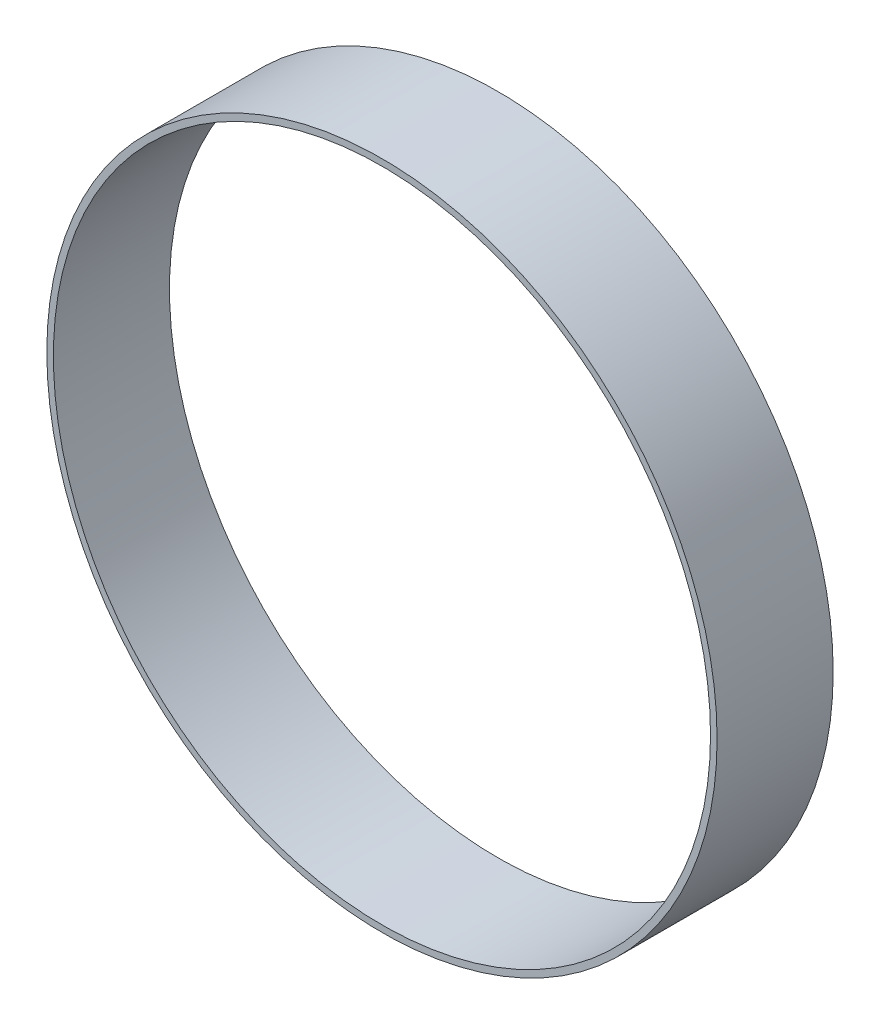
ISO-10303-21;
HEADER;
FILE_DESCRIPTION(('STEP AP214'),'2;1');
FILE_NAME('part.step','',(''),(''),'','','');
FILE_SCHEMA(('AUTOMOTIVE_DESIGN { 1 0 10303 214 1 1 1 1 }'));
ENDSEC;
DATA;
#1=APPLICATION_CONTEXT('core data for automotive mechanical design processes');
#2=APPLICATION_PROTOCOL_DEFINITION('international standard','automotive_design',2000,#1);
#3=PRODUCT_CONTEXT('',#1,'mechanical');
#4=PRODUCT('Part','Part','',(#3));
#5=PRODUCT_RELATED_PRODUCT_CATEGORY('part','',(#4));
#6=PRODUCT_DEFINITION_FORMATION('','',#4);
#7=PRODUCT_DEFINITION_CONTEXT('part definition',#1,'design');
#8=PRODUCT_DEFINITION('design','',#6,#7);
#9=PRODUCT_DEFINITION_SHAPE('','',#8);
#10=(LENGTH_UNIT() NAMED_UNIT(*) SI_UNIT(.MILLI.,.METRE.));
#11=(NAMED_UNIT(*) PLANE_ANGLE_UNIT() SI_UNIT($,.RADIAN.));
#12=(NAMED_UNIT(*) SI_UNIT($,.STERADIAN.) SOLID_ANGLE_UNIT());
#13=UNCERTAINTY_MEASURE_WITH_UNIT(LENGTH_MEASURE(1.E-05),#10,'distance_accuracy_value','');
#14=(GEOMETRIC_REPRESENTATION_CONTEXT(3) GLOBAL_UNCERTAINTY_ASSIGNED_CONTEXT((#13)) GLOBAL_UNIT_ASSIGNED_CONTEXT((#10,
#11,#12)) REPRESENTATION_CONTEXT('',''));
#15=CARTESIAN_POINT('',(0.,0.,0.));
#16=DIRECTION('',(0.,0.,1.));
#17=DIRECTION('',(1.,0.,0.));
#18=AXIS2_PLACEMENT_3D('',#15,#16,#17);
#19=CARTESIAN_POINT('',(0.,0.,53.));
#20=DIRECTION('',(0.,0.,1.));
#21=DIRECTION('',(1.,0.,0.));
#22=AXIS2_PLACEMENT_3D('',#19,#20,#21);
#23=PLANE('',#22);
#24=CARTESIAN_POINT('',(0.,0.,53.));
#25=DIRECTION('',(0.,0.,1.));
#26=DIRECTION('',(1.,0.,0.));
#27=AXIS2_PLACEMENT_3D('',#24,#25,#26);
#28=CIRCLE('',#27,153.);
#29=CARTESIAN_POINT('',(153.,0.,53.));
#30=VERTEX_POINT('',#29);
#31=EDGE_CURVE('E11',#30,#30,#28,.T.);
#32=ORIENTED_EDGE('',*,*,#31,.T.);
#33=EDGE_LOOP('',(#32));
#34=FACE_BOUND('',#33,.T.);
#35=CARTESIAN_POINT('',(0.,0.,53.));
#36=DIRECTION('',(0.,0.,1.));
#37=DIRECTION('',(1.,0.,0.));
#38=AXIS2_PLACEMENT_3D('',#35,#36,#37);
#39=CIRCLE('',#38,150.);
#40=CARTESIAN_POINT('',(150.,0.,53.));
#41=VERTEX_POINT('',#40);
#42=EDGE_CURVE('E54',#41,#41,#39,.T.);
#43=ORIENTED_EDGE('',*,*,#42,.F.);
#44=EDGE_LOOP('',(#43));
#45=FACE_BOUND('',#44,.T.);
#46=ADVANCED_FACE('F43',(#34,#45),#23,.T.);
#47=CARTESIAN_POINT('',(0.,0.,0.));
#48=DIRECTION('',(0.,0.,1.));
#49=DIRECTION('',(1.,0.,0.));
#50=AXIS2_PLACEMENT_3D('',#47,#48,#49);
#51=PLANE('',#50);
#52=CARTESIAN_POINT('',(0.,0.,0.));
#53=DIRECTION('',(0.,0.,1.));
#54=DIRECTION('',(1.,0.,0.));
#55=AXIS2_PLACEMENT_3D('',#52,#53,#54);
#56=CIRCLE('',#55,153.);
#57=CARTESIAN_POINT('',(153.,0.,0.));
#58=VERTEX_POINT('',#57);
#59=EDGE_CURVE('E47',#58,#58,#56,.T.);
#60=ORIENTED_EDGE('',*,*,#59,.F.);
#61=EDGE_LOOP('',(#60));
#62=FACE_BOUND('',#61,.T.);
#63=CARTESIAN_POINT('',(0.,0.,0.));
#64=DIRECTION('',(0.,0.,1.));
#65=DIRECTION('',(1.,0.,0.));
#66=AXIS2_PLACEMENT_3D('',#63,#64,#65);
#67=CIRCLE('',#66,150.);
#68=CARTESIAN_POINT('',(150.,0.,0.));
#69=VERTEX_POINT('',#68);
#70=EDGE_CURVE('E56',#69,#69,#67,.T.);
#71=ORIENTED_EDGE('',*,*,#70,.T.);
#72=EDGE_LOOP('',(#71));
#73=FACE_BOUND('',#72,.T.);
#74=ADVANCED_FACE('F65',(#62,#73),#51,.F.);
#75=CARTESIAN_POINT('',(0.,0.,53.));
#76=DIRECTION('',(0.,0.,-1.));
#77=DIRECTION('',(-1.,0.,0.));
#78=AXIS2_PLACEMENT_3D('',#75,#76,#77);
#79=CYLINDRICAL_SURFACE('',#78,153.);
#80=ORIENTED_EDGE('',*,*,#59,.T.);
#81=EDGE_LOOP('',(#80));
#82=FACE_BOUND('',#81,.T.);
#83=ORIENTED_EDGE('',*,*,#31,.F.);
#84=EDGE_LOOP('',(#83));
#85=FACE_BOUND('',#84,.T.);
#86=ADVANCED_FACE('F45',(#82,#85),#79,.T.);
#87=CARTESIAN_POINT('',(0.,0.,53.));
#88=DIRECTION('',(0.,0.,-1.));
#89=DIRECTION('',(-1.,0.,0.));
#90=AXIS2_PLACEMENT_3D('',#87,#88,#89);
#91=CYLINDRICAL_SURFACE('',#90,150.);
#92=ORIENTED_EDGE('',*,*,#70,.F.);
#93=EDGE_LOOP('',(#92));
#94=FACE_BOUND('',#93,.T.);
#95=ORIENTED_EDGE('',*,*,#42,.T.);
#96=EDGE_LOOP('',(#95));
#97=FACE_BOUND('',#96,.T.);
#98=ADVANCED_FACE('F62',(#94,#97),#91,.F.);
#99=CLOSED_SHELL('',(#46,#74,#86,#98));
#100=MANIFOLD_SOLID_BREP('B2',#99);
#101=ADVANCED_BREP_SHAPE_REPRESENTATION('',(#18,#100),#14);
#102=SHAPE_DEFINITION_REPRESENTATION(#9,#101);
ENDSEC;
END-ISO-10303-21;
